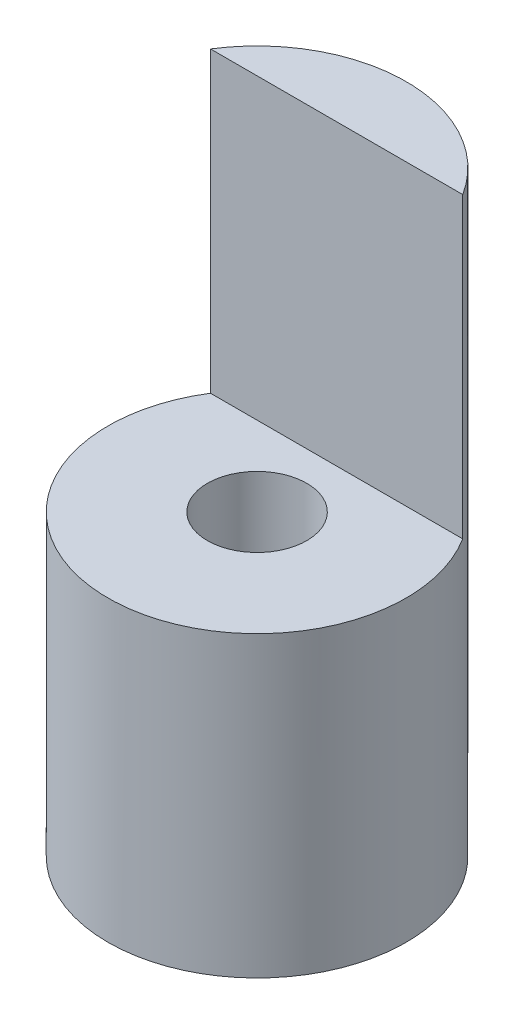
ISO-10303-21;
HEADER;
FILE_DESCRIPTION(('STEP AP214'),'2;1');
FILE_NAME('part.step','',(''),(''),'','','');
FILE_SCHEMA(('AUTOMOTIVE_DESIGN { 1 0 10303 214 1 1 1 1 }'));
ENDSEC;
DATA;
#1=APPLICATION_CONTEXT('core data for automotive mechanical design processes');
#2=APPLICATION_PROTOCOL_DEFINITION('international standard','automotive_design',2000,#1);
#3=PRODUCT_CONTEXT('',#1,'mechanical');
#4=PRODUCT('Part','Part','',(#3));
#5=PRODUCT_RELATED_PRODUCT_CATEGORY('part','',(#4));
#6=PRODUCT_DEFINITION_FORMATION('','',#4);
#7=PRODUCT_DEFINITION_CONTEXT('part definition',#1,'design');
#8=PRODUCT_DEFINITION('design','',#6,#7);
#9=PRODUCT_DEFINITION_SHAPE('','',#8);
#10=(LENGTH_UNIT() NAMED_UNIT(*) SI_UNIT(.MILLI.,.METRE.));
#11=(NAMED_UNIT(*) PLANE_ANGLE_UNIT() SI_UNIT($,.RADIAN.));
#12=(NAMED_UNIT(*) SI_UNIT($,.STERADIAN.) SOLID_ANGLE_UNIT());
#13=UNCERTAINTY_MEASURE_WITH_UNIT(LENGTH_MEASURE(1.E-05),#10,'distance_accuracy_value','');
#14=(GEOMETRIC_REPRESENTATION_CONTEXT(3) GLOBAL_UNCERTAINTY_ASSIGNED_CONTEXT((#13)) GLOBAL_UNIT_ASSIGNED_CONTEXT((#10,
#11,#12)) REPRESENTATION_CONTEXT('',''));
#15=CARTESIAN_POINT('',(0.,0.,0.));
#16=DIRECTION('',(0.,0.,1.));
#17=DIRECTION('',(1.,0.,0.));
#18=AXIS2_PLACEMENT_3D('',#15,#16,#17);
#19=CARTESIAN_POINT('',(0.,-15.,0.));
#20=DIRECTION('',(0.,1.,0.));
#21=DIRECTION('',(0.,0.,1.));
#22=AXIS2_PLACEMENT_3D('',#19,#20,#21);
#23=CYLINDRICAL_SURFACE('',#22,2.5);
#24=CARTESIAN_POINT('',(0.,-15.,0.));
#25=DIRECTION('',(0.,1.,0.));
#26=DIRECTION('',(0.,0.,1.));
#27=AXIS2_PLACEMENT_3D('',#24,#25,#26);
#28=CIRCLE('',#27,2.5);
#29=CARTESIAN_POINT('',(0.,-15.,2.5));
#30=VERTEX_POINT('',#29);
#31=EDGE_CURVE('E100',#30,#30,#28,.T.);
#32=ORIENTED_EDGE('',*,*,#31,.F.);
#33=EDGE_LOOP('',(#32));
#34=FACE_BOUND('',#33,.T.);
#35=CARTESIAN_POINT('',(0.,0.,0.));
#36=DIRECTION('',(0.,1.,0.));
#37=DIRECTION('',(0.,0.,1.));
#38=AXIS2_PLACEMENT_3D('',#35,#36,#37);
#39=CIRCLE('',#38,2.5);
#40=CARTESIAN_POINT('',(0.,0.,2.5));
#41=VERTEX_POINT('',#40);
#42=EDGE_CURVE('E39',#41,#41,#39,.F.);
#43=ORIENTED_EDGE('',*,*,#42,.F.);
#44=EDGE_LOOP('',(#43));
#45=FACE_BOUND('',#44,.T.);
#46=ADVANCED_FACE('F35',(#34,#45),#23,.F.);
#47=CARTESIAN_POINT('',(0.,15.,0.));
#48=DIRECTION('',(0.,-1.,0.));
#49=DIRECTION('',(0.,0.,-1.));
#50=AXIS2_PLACEMENT_3D('',#47,#48,#49);
#51=CYLINDRICAL_SURFACE('',#50,7.5);
#52=CARTESIAN_POINT('',(0.,15.,0.));
#53=DIRECTION('',(0.,1.,0.));
#54=DIRECTION('',(0.,0.,1.));
#55=AXIS2_PLACEMENT_3D('',#52,#53,#54);
#56=CIRCLE('',#55,7.5);
#57=CARTESIAN_POINT('',(6.34428877022476,15.,-4.));
#58=VERTEX_POINT('',#57);
#59=CARTESIAN_POINT('',(-6.34428877022476,15.,-4.));
#60=VERTEX_POINT('',#59);
#61=EDGE_CURVE('E11',#58,#60,#56,.T.);
#62=ORIENTED_EDGE('',*,*,#61,.F.);
#63=DIRECTION('',(0.,1.,0.));
#64=VECTOR('',#63,1.);
#65=CARTESIAN_POINT('',(6.34428877022476,0.,-4.));
#66=LINE('',#65,#64);
#67=CARTESIAN_POINT('',(6.34428877022476,0.,-4.));
#68=VERTEX_POINT('',#67);
#69=EDGE_CURVE('E52',#68,#58,#66,.T.);
#70=ORIENTED_EDGE('',*,*,#69,.F.);
#71=CARTESIAN_POINT('',(0.,0.,0.));
#72=DIRECTION('',(0.,1.,0.));
#73=DIRECTION('',(0.,0.,1.));
#74=AXIS2_PLACEMENT_3D('',#71,#72,#73);
#75=CIRCLE('',#74,7.5);
#76=CARTESIAN_POINT('',(-6.34428877022476,0.,-4.));
#77=VERTEX_POINT('',#76);
#78=EDGE_CURVE('E67',#77,#68,#75,.T.);
#79=ORIENTED_EDGE('',*,*,#78,.F.);
#80=DIRECTION('',(0.,1.,0.));
#81=VECTOR('',#80,1.);
#82=CARTESIAN_POINT('',(-6.34428877022476,0.,-4.));
#83=LINE('',#82,#81);
#84=EDGE_CURVE('E58',#77,#60,#83,.T.);
#85=ORIENTED_EDGE('',*,*,#84,.T.);
#86=EDGE_LOOP('',(#62,#70,#79,#85));
#87=FACE_BOUND('',#86,.T.);
#88=CARTESIAN_POINT('',(0.,-15.,0.));
#89=DIRECTION('',(0.,1.,0.));
#90=DIRECTION('',(0.,0.,1.));
#91=AXIS2_PLACEMENT_3D('',#88,#89,#90);
#92=CIRCLE('',#91,7.5);
#93=CARTESIAN_POINT('',(0.,-15.,7.5));
#94=VERTEX_POINT('',#93);
#95=EDGE_CURVE('E44',#94,#94,#92,.T.);
#96=ORIENTED_EDGE('',*,*,#95,.T.);
#97=EDGE_LOOP('',(#96));
#98=FACE_BOUND('',#97,.T.);
#99=ADVANCED_FACE('F37',(#87,#98),#51,.T.);
#100=CARTESIAN_POINT('',(0.,15.,0.));
#101=DIRECTION('',(0.,1.,0.));
#102=DIRECTION('',(0.,0.,1.));
#103=AXIS2_PLACEMENT_3D('',#100,#101,#102);
#104=PLANE('',#103);
#105=DIRECTION('',(-1.,0.,0.));
#106=VECTOR('',#105,1.);
#107=CARTESIAN_POINT('',(-6.34428877022476,15.,-4.));
#108=LINE('',#107,#106);
#109=EDGE_CURVE('E63',#58,#60,#108,.T.);
#110=ORIENTED_EDGE('',*,*,#109,.F.);
#111=ORIENTED_EDGE('',*,*,#61,.T.);
#112=EDGE_LOOP('',(#110,#111));
#113=FACE_BOUND('',#112,.T.);
#114=ADVANCED_FACE('F73',(#113),#104,.T.);
#115=CARTESIAN_POINT('',(0.,-15.,0.));
#116=DIRECTION('',(0.,1.,0.));
#117=DIRECTION('',(0.,0.,1.));
#118=AXIS2_PLACEMENT_3D('',#115,#116,#117);
#119=PLANE('',#118);
#120=ORIENTED_EDGE('',*,*,#31,.T.);
#121=EDGE_LOOP('',(#120));
#122=FACE_BOUND('',#121,.T.);
#123=ORIENTED_EDGE('',*,*,#95,.F.);
#124=EDGE_LOOP('',(#123));
#125=FACE_BOUND('',#124,.T.);
#126=ADVANCED_FACE('F75',(#122,#125),#119,.F.);
#127=CARTESIAN_POINT('',(0.,0.,0.));
#128=DIRECTION('',(0.,1.,0.));
#129=DIRECTION('',(0.,0.,1.));
#130=AXIS2_PLACEMENT_3D('',#127,#128,#129);
#131=PLANE('',#130);
#132=ORIENTED_EDGE('',*,*,#78,.T.);
#133=DIRECTION('',(-1.,0.,0.));
#134=VECTOR('',#133,1.);
#135=CARTESIAN_POINT('',(-6.34428877022476,0.,-4.));
#136=LINE('',#135,#134);
#137=EDGE_CURVE('E105',#68,#77,#136,.T.);
#138=ORIENTED_EDGE('',*,*,#137,.T.);
#139=EDGE_LOOP('',(#132,#138));
#140=FACE_BOUND('',#139,.T.);
#141=ORIENTED_EDGE('',*,*,#42,.T.);
#142=EDGE_LOOP('',(#141));
#143=FACE_BOUND('',#142,.T.);
#144=ADVANCED_FACE('F81',(#140,#143),#131,.T.);
#145=CARTESIAN_POINT('',(-6.34428877022476,0.,-4.));
#146=DIRECTION('',(0.,0.,-1.));
#147=DIRECTION('',(-1.,0.,0.));
#148=AXIS2_PLACEMENT_3D('',#145,#146,#147);
#149=PLANE('',#148);
#150=ORIENTED_EDGE('',*,*,#109,.T.);
#151=ORIENTED_EDGE('',*,*,#84,.F.);
#152=ORIENTED_EDGE('',*,*,#137,.F.);
#153=ORIENTED_EDGE('',*,*,#69,.T.);
#154=EDGE_LOOP('',(#150,#151,#152,#153));
#155=FACE_BOUND('',#154,.T.);
#156=ADVANCED_FACE('F64',(#155),#149,.F.);
#157=CLOSED_SHELL('',(#46,#99,#114,#126,#144,#156));
#158=MANIFOLD_SOLID_BREP('B2',#157);
#159=ADVANCED_BREP_SHAPE_REPRESENTATION('',(#18,#158),#14);
#160=SHAPE_DEFINITION_REPRESENTATION(#9,#159);
ENDSEC;
END-ISO-10303-21;
